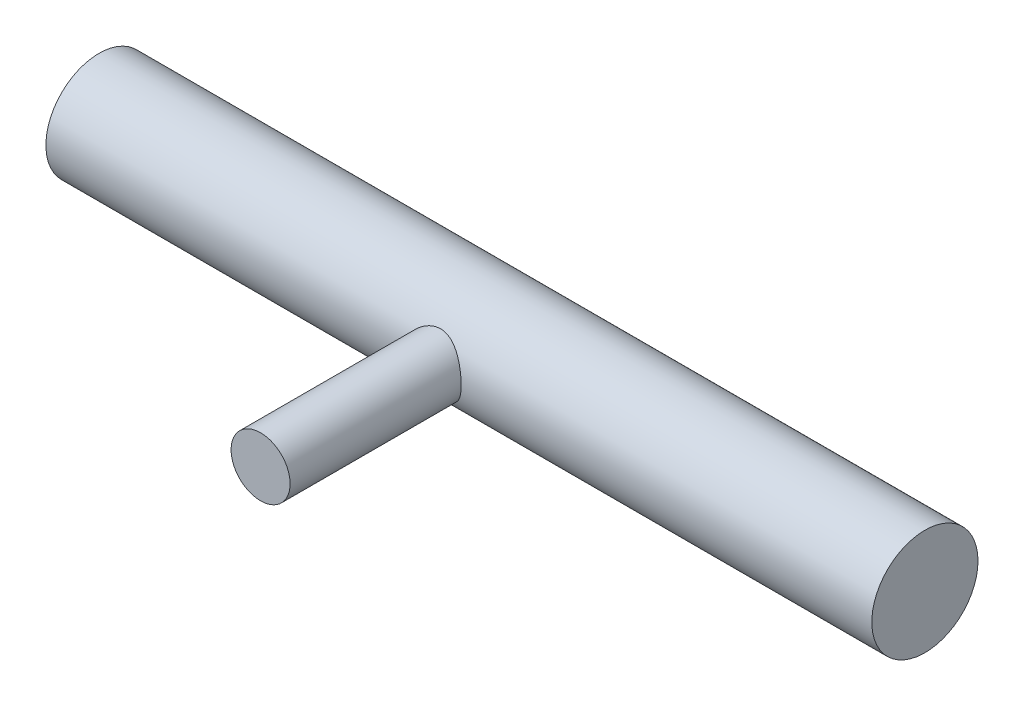
ISO-10303-21;
HEADER;
FILE_DESCRIPTION(('STEP AP214'),'2;1');
FILE_NAME('part.step','',(''),(''),'','','');
FILE_SCHEMA(('AUTOMOTIVE_DESIGN { 1 0 10303 214 1 1 1 1 }'));
ENDSEC;
DATA;
#1=APPLICATION_CONTEXT('core data for automotive mechanical design processes');
#2=APPLICATION_PROTOCOL_DEFINITION('international standard','automotive_design',2000,#1);
#3=PRODUCT_CONTEXT('',#1,'mechanical');
#4=PRODUCT('Part','Part','',(#3));
#5=PRODUCT_RELATED_PRODUCT_CATEGORY('part','',(#4));
#6=PRODUCT_DEFINITION_FORMATION('','',#4);
#7=PRODUCT_DEFINITION_CONTEXT('part definition',#1,'design');
#8=PRODUCT_DEFINITION('design','',#6,#7);
#9=PRODUCT_DEFINITION_SHAPE('','',#8);
#10=(LENGTH_UNIT() NAMED_UNIT(*) SI_UNIT(.MILLI.,.METRE.));
#11=(NAMED_UNIT(*) PLANE_ANGLE_UNIT() SI_UNIT($,.RADIAN.));
#12=(NAMED_UNIT(*) SI_UNIT($,.STERADIAN.) SOLID_ANGLE_UNIT());
#13=UNCERTAINTY_MEASURE_WITH_UNIT(LENGTH_MEASURE(1.E-05),#10,'distance_accuracy_value','');
#14=(GEOMETRIC_REPRESENTATION_CONTEXT(3) GLOBAL_UNCERTAINTY_ASSIGNED_CONTEXT((#13)) GLOBAL_UNIT_ASSIGNED_CONTEXT((#10,
#11,#12)) REPRESENTATION_CONTEXT('',''));
#15=CARTESIAN_POINT('',(0.,0.,0.));
#16=DIRECTION('',(0.,0.,1.));
#17=DIRECTION('',(1.,0.,0.));
#18=AXIS2_PLACEMENT_3D('',#15,#16,#17);
#19=CARTESIAN_POINT('',(70.,0.,0.));
#20=DIRECTION('',(-1.,0.,0.));
#21=DIRECTION('',(0.,0.,1.));
#22=AXIS2_PLACEMENT_3D('',#19,#20,#21);
#23=CYLINDRICAL_SURFACE('',#22,4.5);
#24=CARTESIAN_POINT('',(35.1966925710122,0.,4.5));
#25=CARTESIAN_POINT('',(35.1966962362034,-0.12975809020767,4.50000314465333));
#26=CARTESIAN_POINT('',(35.1865460006552,-0.259495048046454,4.49433969900333));
#27=CARTESIAN_POINT('',(35.1465007095403,-0.514936094239152,4.4722793076248));
#28=CARTESIAN_POINT('',(35.1166019896557,-0.64063942961742,4.45588036993802));
#29=CARTESIAN_POINT('',(35.0386324139469,-0.884087336941568,4.41402427059755));
#30=CARTESIAN_POINT('',(34.9906283168898,-1.0018592959983,4.3886004059786));
#31=CARTESIAN_POINT('',(34.8782609021481,-1.2274597175802,4.33092577070178));
#32=CARTESIAN_POINT('',(34.8138936536269,-1.33528578235963,4.29867335996867));
#33=CARTESIAN_POINT('',(34.6656058885092,-1.54633615143593,4.22753981437698));
#34=CARTESIAN_POINT('',(34.5806369232734,-1.64871905556101,4.18835368821003));
#35=CARTESIAN_POINT('',(34.3958599036454,-1.83858802759269,4.10855473455516));
#36=CARTESIAN_POINT('',(34.2960368862294,-1.92605888117931,4.06794050035681));
#37=CARTESIAN_POINT('',(34.0723773607809,-2.09257063902238,3.98505246395041));
#38=CARTESIAN_POINT('',(33.9471324698051,-2.16985882134631,3.94302761192723));
#39=CARTESIAN_POINT('',(33.6830011797376,-2.30193682615168,3.86741690619417));
#40=CARTESIAN_POINT('',(33.5441346666272,-2.35675885816852,3.83381899786442));
#41=CARTESIAN_POINT('',(33.2866353480645,-2.43228219832065,3.78623301761536));
#42=CARTESIAN_POINT('',(33.1698828924198,-2.4577327823494,3.76960776715246));
#43=CARTESIAN_POINT('',(32.9329569318963,-2.49167870940791,3.74726165075166));
#44=CARTESIAN_POINT('',(32.8127869180401,-2.50019076575653,3.74153003626678));
#45=CARTESIAN_POINT('',(32.5723614758396,-2.49980245234748,3.74178926850116));
#46=CARTESIAN_POINT('',(32.4521060979552,-2.49088301540577,3.74779295170549));
#47=CARTESIAN_POINT('',(32.2151146326117,-2.45610447914475,3.77067196518534));
#48=CARTESIAN_POINT('',(32.0983808852365,-2.43023436481244,3.78755436462961));
#49=CARTESIAN_POINT('',(31.871260323019,-2.36277650709342,3.82999424192159));
#50=CARTESIAN_POINT('',(31.7608749255854,-2.32118526919618,3.85555364837623));
#51=CARTESIAN_POINT('',(31.5482850471574,-2.22370256843741,3.91258606121716));
#52=CARTESIAN_POINT('',(31.4460837819397,-2.16780552026577,3.94406137602941));
#53=CARTESIAN_POINT('',(31.2362792756729,-2.03346434937434,4.01517496523541));
#54=CARTESIAN_POINT('',(31.1302153175948,-1.95288470610687,4.05532685168251));
#55=CARTESIAN_POINT('',(30.9321556183791,-1.77596825202837,4.13586693478144));
#56=CARTESIAN_POINT('',(30.8401710912515,-1.67961900609975,4.17625529347124));
#57=CARTESIAN_POINT('',(30.6635436207064,-1.46213900169328,4.25757409114108));
#58=CARTESIAN_POINT('',(30.5805903788905,-1.33948616107142,4.29814437745206));
#59=CARTESIAN_POINT('',(30.4368820222685,-1.07947802612397,4.37068555059183));
#60=CARTESIAN_POINT('',(30.3761122953957,-0.942132487120802,4.40266209436034));
#61=CARTESIAN_POINT('',(30.2831817351595,-0.666748026155529,4.45237093488905));
#62=CARTESIAN_POINT('',(30.2492978016214,-0.529448884330626,4.47095250953231));
#63=CARTESIAN_POINT('',(30.2052188657678,-0.250024186967254,4.49522961224014));
#64=CARTESIAN_POINT('',(30.1950029410214,-0.107903006965386,4.50093652134351));
#65=CARTESIAN_POINT('',(30.1986257898593,0.159736992061373,4.49892791417126));
#66=CARTESIAN_POINT('',(30.2098693194715,0.285311755713919,4.49266045059942));
#67=CARTESIAN_POINT('',(30.250844428322,0.53246138934213,4.47010960580979));
#68=CARTESIAN_POINT('',(30.2805766083464,0.654036129202425,4.45382589911581));
#69=CARTESIAN_POINT('',(30.3570638813988,0.889626042147521,4.41280294973003));
#70=CARTESIAN_POINT('',(30.4037562194507,1.00366727511818,4.38809489870751));
#71=CARTESIAN_POINT('',(30.512518753362,1.22242448859808,4.33225575192423));
#72=CARTESIAN_POINT('',(30.5745930643288,1.32713796346355,4.30112293773311));
#73=CARTESIAN_POINT('',(30.7196047628489,1.5358708210238,4.23136184219272));
#74=CARTESIAN_POINT('',(30.8040333232004,1.63870553707676,4.19229170580865));
#75=CARTESIAN_POINT('',(30.9877856442289,1.82953913965854,4.11260317218189));
#76=CARTESIAN_POINT('',(31.0871257734399,1.91752149430535,4.07198311058146));
#77=CARTESIAN_POINT('',(31.3097542186269,2.08511961470324,3.9889686233733));
#78=CARTESIAN_POINT('',(31.4344468385367,2.16300015680815,3.94680755532471));
#79=CARTESIAN_POINT('',(31.6975372293918,2.2963793260761,3.87073262793339));
#80=CARTESIAN_POINT('',(31.8359152679901,2.35190960941741,3.83680713123626));
#81=CARTESIAN_POINT('',(32.0929095411228,2.42888889767732,3.78841904471707));
#82=CARTESIAN_POINT('',(32.2096338433482,2.45502886139893,3.77137372433235));
#83=CARTESIAN_POINT('',(32.4466392083553,2.49033925721538,3.74815645586868));
#84=CARTESIAN_POINT('',(32.566916596053,2.49952663983992,3.74197364688922));
#85=CARTESIAN_POINT('',(32.8077143281433,2.50043819091778,3.74136462499468));
#86=CARTESIAN_POINT('',(32.9282347886345,2.49214061904493,3.74695304811209));
#87=CARTESIAN_POINT('',(33.1658605562818,2.45851643173268,3.76909609648361));
#88=CARTESIAN_POINT('',(33.2829636327833,2.43317894212459,3.78565772428186));
#89=CARTESIAN_POINT('',(33.510511436432,2.36679483205658,3.82750534381749));
#90=CARTESIAN_POINT('',(33.6209751243624,2.32579567267026,3.85276495463758));
#91=CARTESIAN_POINT('',(33.8338008545327,2.2294944202124,3.90927937487658));
#92=CARTESIAN_POINT('',(33.9361597560327,2.17418681746632,3.94053649252252));
#93=CARTESIAN_POINT('',(34.1462548635883,2.04119262548491,4.01123588994594));
#94=CARTESIAN_POINT('',(34.2524769840086,1.96138962505477,4.05120181770526));
#95=CARTESIAN_POINT('',(34.4509876890471,1.78605931033159,4.13150106760694));
#96=CARTESIAN_POINT('',(34.5432649015192,1.69051929369338,4.17183466146658));
#97=CARTESIAN_POINT('',(34.7209052188803,1.4744786624671,4.25330121765015));
#98=CARTESIAN_POINT('',(34.8045482167982,1.35241492924802,4.29408020269288));
#99=CARTESIAN_POINT('',(34.9497476358199,1.09349141366304,4.36718657718673));
#100=CARTESIAN_POINT('',(35.0113201702017,0.956642521083953,4.39952012781041));
#101=CARTESIAN_POINT('',(35.1049640090175,0.684823227607027,4.44953408218068));
#102=CARTESIAN_POINT('',(35.1391952191498,0.55079661051483,4.46827306143731));
#103=CARTESIAN_POINT('',(35.1850486824166,0.277835968952609,4.49349953832038));
#104=CARTESIAN_POINT('',(35.1966886474295,0.1389058759711,4.49999663365248));
#105=CARTESIAN_POINT('',(35.1966925710122,0.,4.5));
#106=B_SPLINE_CURVE_WITH_KNOTS('',3,(#24,#25,#26,#27,#28,#29,#30,#31,#32,#33,#34,#35,#36,#37,
#38,#39,#40,#41,#42,#43,#44,#45,#46,#47,#48,#49,#50,#51,#52,#53,#54,#55,#56,#57,#58,#59,#60,#61,
#62,#63,#64,#65,#66,#67,#68,#69,#70,#71,#72,#73,#74,#75,#76,#77,#78,#79,#80,#81,#82,#83,#84,#85,
#86,#87,#88,#89,#90,#91,#92,#93,#94,#95,#96,#97,#98,#99,#100,#101,#102,#103,#104,#105),
.UNSPECIFIED.,.T.,.F.,(4,2,2,2,2,2,2,2,2,2,2,2,2,2,2,2,2,2,2,2,2,2,2,2,2,2,2,2,2,2,2,2,2,2,2,2,
2,2,2,2,4),(0.,0.388735550907335,0.777543251702007,1.16493112478047,1.55241214615886,
1.96683794951781,2.38168408101694,2.83857267136893,3.29480391312177,3.65516176649212,
4.01516387654729,4.37555999005168,4.73619053136809,5.09690128126582,5.4577530761622,
5.87344204444461,6.28946039758512,6.74765475008834,7.20554674747984,7.6309694496169,
8.05601593594988,8.43288535066558,8.80976701233838,9.18526813217116,9.56086981770377,
9.97519675058505,10.389981864785,10.846544170616,11.3024575214123,11.6633530399674,
12.0238875107278,12.3848705249248,12.7460841223787,13.1062116731934,13.466478103307,
13.8810342040651,14.2959265740116,14.7540149206223,15.2117681400764,15.6282357181935,
16.0443766473137),.UNSPECIFIED.);
#107=CARTESIAN_POINT('',(35.1966925710122,0.,4.5));
#108=VERTEX_POINT('',#107);
#109=EDGE_CURVE('E41',#108,#108,#106,.T.);
#110=ORIENTED_EDGE('',*,*,#109,.T.);
#111=EDGE_LOOP('',(#110));
#112=FACE_BOUND('',#111,.T.);
#113=CARTESIAN_POINT('',(70.,0.,0.));
#114=DIRECTION('',(1.,0.,0.));
#115=DIRECTION('',(0.,0.,-1.));
#116=AXIS2_PLACEMENT_3D('',#113,#114,#115);
#117=CIRCLE('',#116,4.5);
#118=CARTESIAN_POINT('',(70.,0.,-4.5));
#119=VERTEX_POINT('',#118);
#120=EDGE_CURVE('E10',#119,#119,#117,.T.);
#121=ORIENTED_EDGE('',*,*,#120,.F.);
#122=EDGE_LOOP('',(#121));
#123=FACE_BOUND('',#122,.T.);
#124=CARTESIAN_POINT('',(0.,0.,0.));
#125=DIRECTION('',(1.,0.,0.));
#126=DIRECTION('',(0.,0.,-1.));
#127=AXIS2_PLACEMENT_3D('',#124,#125,#126);
#128=CIRCLE('',#127,4.5);
#129=CARTESIAN_POINT('',(0.,0.,-4.5));
#130=VERTEX_POINT('',#129);
#131=EDGE_CURVE('E50',#130,#130,#128,.T.);
#132=ORIENTED_EDGE('',*,*,#131,.T.);
#133=EDGE_LOOP('',(#132));
#134=FACE_BOUND('',#133,.T.);
#135=ADVANCED_FACE('F37',(#112,#123,#134),#23,.T.);
#136=CARTESIAN_POINT('',(70.,0.,0.));
#137=DIRECTION('',(1.,0.,0.));
#138=DIRECTION('',(0.,0.,-1.));
#139=AXIS2_PLACEMENT_3D('',#136,#137,#138);
#140=PLANE('',#139);
#141=ORIENTED_EDGE('',*,*,#120,.T.);
#142=EDGE_LOOP('',(#141));
#143=FACE_BOUND('',#142,.T.);
#144=ADVANCED_FACE('F78',(#143),#140,.T.);
#145=CARTESIAN_POINT('',(0.,0.,0.));
#146=DIRECTION('',(1.,0.,0.));
#147=DIRECTION('',(0.,0.,-1.));
#148=AXIS2_PLACEMENT_3D('',#145,#146,#147);
#149=PLANE('',#148);
#150=ORIENTED_EDGE('',*,*,#131,.F.);
#151=EDGE_LOOP('',(#150));
#152=FACE_BOUND('',#151,.T.);
#153=ADVANCED_FACE('F71',(#152),#149,.F.);
#154=CARTESIAN_POINT('',(32.6966925710122,0.,1.));
#155=DIRECTION('',(0.,0.,1.));
#156=DIRECTION('',(1.,0.,0.));
#157=AXIS2_PLACEMENT_3D('',#154,#155,#156);
#158=CYLINDRICAL_SURFACE('',#157,2.5);
#159=CARTESIAN_POINT('',(32.6966925710122,0.,19.));
#160=DIRECTION('',(0.,0.,1.));
#161=DIRECTION('',(1.,0.,0.));
#162=AXIS2_PLACEMENT_3D('',#159,#160,#161);
#163=CIRCLE('',#162,2.5);
#164=CARTESIAN_POINT('',(35.1966925710122,0.,19.));
#165=VERTEX_POINT('',#164);
#166=EDGE_CURVE('E57',#165,#165,#163,.T.);
#167=ORIENTED_EDGE('',*,*,#166,.F.);
#168=EDGE_LOOP('',(#167));
#169=FACE_BOUND('',#168,.T.);
#170=ORIENTED_EDGE('',*,*,#109,.F.);
#171=EDGE_LOOP('',(#170));
#172=FACE_BOUND('',#171,.T.);
#173=ADVANCED_FACE('F68',(#169,#172),#158,.T.);
#174=CARTESIAN_POINT('',(32.6966925710122,0.,19.));
#175=DIRECTION('',(0.,0.,1.));
#176=DIRECTION('',(1.,0.,0.));
#177=AXIS2_PLACEMENT_3D('',#174,#175,#176);
#178=PLANE('',#177);
#179=ORIENTED_EDGE('',*,*,#166,.T.);
#180=EDGE_LOOP('',(#179));
#181=FACE_BOUND('',#180,.T.);
#182=ADVANCED_FACE('F70',(#181),#178,.T.);
#183=CLOSED_SHELL('',(#135,#144,#153,#173,#182));
#184=MANIFOLD_SOLID_BREP('B2',#183);
#185=ADVANCED_BREP_SHAPE_REPRESENTATION('',(#18,#184),#14);
#186=SHAPE_DEFINITION_REPRESENTATION(#9,#185);
ENDSEC;
END-ISO-10303-21;
